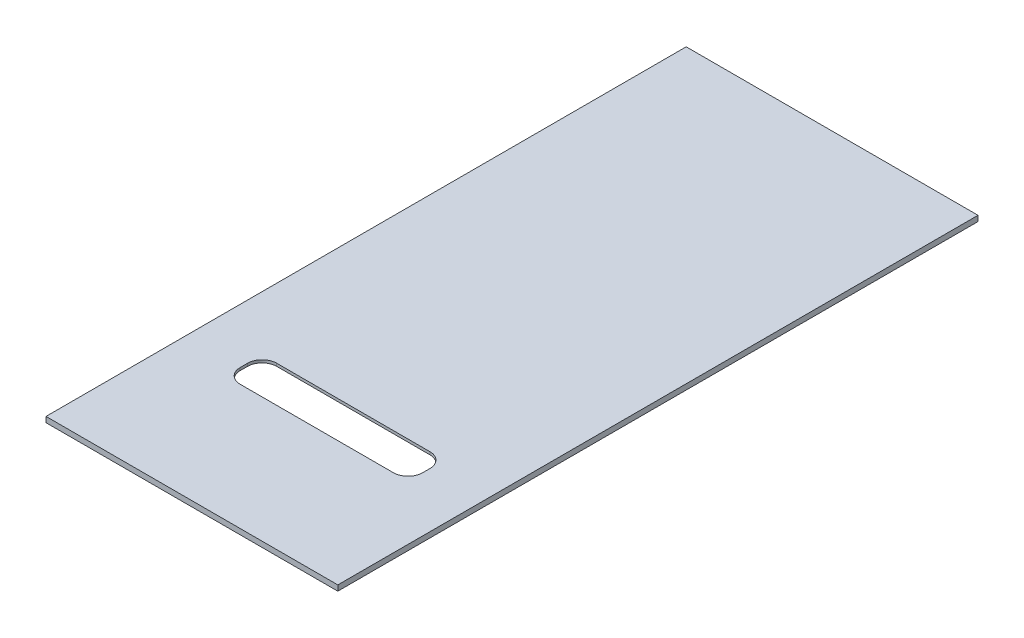
ISO-10303-21;
HEADER;
FILE_DESCRIPTION(('STEP AP214'),'2;1');
FILE_NAME('part.step','',(''),(''),'','','');
FILE_SCHEMA(('AUTOMOTIVE_DESIGN { 1 0 10303 214 1 1 1 1 }'));
ENDSEC;
DATA;
#1=APPLICATION_CONTEXT('core data for automotive mechanical design processes');
#2=APPLICATION_PROTOCOL_DEFINITION('international standard','automotive_design',2000,#1);
#3=PRODUCT_CONTEXT('',#1,'mechanical');
#4=PRODUCT('Part','Part','',(#3));
#5=PRODUCT_RELATED_PRODUCT_CATEGORY('part','',(#4));
#6=PRODUCT_DEFINITION_FORMATION('','',#4);
#7=PRODUCT_DEFINITION_CONTEXT('part definition',#1,'design');
#8=PRODUCT_DEFINITION('design','',#6,#7);
#9=PRODUCT_DEFINITION_SHAPE('','',#8);
#10=(LENGTH_UNIT() NAMED_UNIT(*) SI_UNIT(.MILLI.,.METRE.));
#11=(NAMED_UNIT(*) PLANE_ANGLE_UNIT() SI_UNIT($,.RADIAN.));
#12=(NAMED_UNIT(*) SI_UNIT($,.STERADIAN.) SOLID_ANGLE_UNIT());
#13=UNCERTAINTY_MEASURE_WITH_UNIT(LENGTH_MEASURE(1.E-05),#10,'distance_accuracy_value','');
#14=(GEOMETRIC_REPRESENTATION_CONTEXT(3) GLOBAL_UNCERTAINTY_ASSIGNED_CONTEXT((#13)) GLOBAL_UNIT_ASSIGNED_CONTEXT((#10,
#11,#12)) REPRESENTATION_CONTEXT('',''));
#15=CARTESIAN_POINT('',(0.,0.,0.));
#16=DIRECTION('',(0.,0.,1.));
#17=DIRECTION('',(1.,0.,0.));
#18=AXIS2_PLACEMENT_3D('',#15,#16,#17);
#19=CARTESIAN_POINT('',(80.,0.,223.5));
#20=DIRECTION('',(1.,0.,0.));
#21=DIRECTION('',(0.,0.,-1.));
#22=AXIS2_PLACEMENT_3D('',#19,#20,#21);
#23=PLANE('',#22);
#24=DIRECTION('',(0.,-1.,0.));
#25=VECTOR('',#24,1.);
#26=CARTESIAN_POINT('',(80.,-36.809382195833,175.5));
#27=LINE('',#26,#25);
#28=CARTESIAN_POINT('',(80.,57.,175.5));
#29=VERTEX_POINT('',#28);
#30=CARTESIAN_POINT('',(80.,54.,175.5));
#31=VERTEX_POINT('',#30);
#32=EDGE_CURVE('E281',#29,#31,#27,.T.);
#33=ORIENTED_EDGE('',*,*,#32,.T.);
#34=DIRECTION('',(0.,0.,1.));
#35=VECTOR('',#34,1.);
#36=CARTESIAN_POINT('',(80.,54.,81.));
#37=LINE('',#36,#35);
#38=CARTESIAN_POINT('',(80.,54.,-175.5));
#39=VERTEX_POINT('',#38);
#40=EDGE_CURVE('E183',#39,#31,#37,.T.);
#41=ORIENTED_EDGE('',*,*,#40,.F.);
#42=DIRECTION('',(0.,-1.,0.));
#43=VECTOR('',#42,1.);
#44=CARTESIAN_POINT('',(80.,0.,-175.5));
#45=LINE('',#44,#43);
#46=CARTESIAN_POINT('',(80.,57.,-175.5));
#47=VERTEX_POINT('',#46);
#48=EDGE_CURVE('E176',#47,#39,#45,.T.);
#49=ORIENTED_EDGE('',*,*,#48,.F.);
#50=DIRECTION('',(0.,0.,-1.));
#51=VECTOR('',#50,1.);
#52=CARTESIAN_POINT('',(80.,57.,140.));
#53=LINE('',#52,#51);
#54=EDGE_CURVE('E180',#29,#47,#53,.T.);
#55=ORIENTED_EDGE('',*,*,#54,.F.);
#56=EDGE_LOOP('',(#33,#41,#49,#55));
#57=FACE_BOUND('',#56,.T.);
#58=ADVANCED_FACE('F39',(#57),#23,.T.);
#59=CARTESIAN_POINT('',(-80.,0.,223.5));
#60=DIRECTION('',(1.,0.,0.));
#61=DIRECTION('',(0.,0.,-1.));
#62=AXIS2_PLACEMENT_3D('',#59,#60,#61);
#63=PLANE('',#62);
#64=DIRECTION('',(0.,0.,-1.));
#65=VECTOR('',#64,1.);
#66=CARTESIAN_POINT('',(-80.,57.,140.));
#67=LINE('',#66,#65);
#68=CARTESIAN_POINT('',(-80.,57.,175.5));
#69=VERTEX_POINT('',#68);
#70=CARTESIAN_POINT('',(-80.,57.,-175.5));
#71=VERTEX_POINT('',#70);
#72=EDGE_CURVE('E155',#69,#71,#67,.T.);
#73=ORIENTED_EDGE('',*,*,#72,.T.);
#74=DIRECTION('',(0.,-1.,0.));
#75=VECTOR('',#74,1.);
#76=CARTESIAN_POINT('',(-80.,0.,-175.5));
#77=LINE('',#76,#75);
#78=CARTESIAN_POINT('',(-80.,54.,-175.5));
#79=VERTEX_POINT('',#78);
#80=EDGE_CURVE('E158',#71,#79,#77,.T.);
#81=ORIENTED_EDGE('',*,*,#80,.T.);
#82=DIRECTION('',(0.,0.,1.));
#83=VECTOR('',#82,1.);
#84=CARTESIAN_POINT('',(-80.,54.,81.));
#85=LINE('',#84,#83);
#86=CARTESIAN_POINT('',(-80.,54.,175.5));
#87=VERTEX_POINT('',#86);
#88=EDGE_CURVE('E168',#79,#87,#85,.T.);
#89=ORIENTED_EDGE('',*,*,#88,.T.);
#90=DIRECTION('',(0.,-1.,0.));
#91=VECTOR('',#90,1.);
#92=CARTESIAN_POINT('',(-80.,-36.809382195833,175.5));
#93=LINE('',#92,#91);
#94=EDGE_CURVE('E161',#69,#87,#93,.T.);
#95=ORIENTED_EDGE('',*,*,#94,.F.);
#96=EDGE_LOOP('',(#73,#81,#89,#95));
#97=FACE_BOUND('',#96,.T.);
#98=ADVANCED_FACE('F157',(#97),#63,.F.);
#99=CARTESIAN_POINT('',(-60.5,-85.9125199474914,72.));
#100=DIRECTION('',(0.,0.,1.));
#101=DIRECTION('',(1.,0.,0.));
#102=AXIS2_PLACEMENT_3D('',#99,#100,#101);
#103=PLANE('',#102);
#104=DIRECTION('',(0.,1.,0.));
#105=VECTOR('',#104,1.);
#106=CARTESIAN_POINT('',(-60.5,-85.9125199474914,72.));
#107=LINE('',#106,#105);
#108=CARTESIAN_POINT('',(-60.5,54.,72.));
#109=VERTEX_POINT('',#108);
#110=CARTESIAN_POINT('',(-60.5,55.5,72.));
#111=VERTEX_POINT('',#110);
#112=EDGE_CURVE('E244',#109,#111,#107,.T.);
#113=ORIENTED_EDGE('',*,*,#112,.F.);
#114=DIRECTION('',(1.,0.,0.));
#115=VECTOR('',#114,1.);
#116=CARTESIAN_POINT('',(-60.5,54.,72.));
#117=LINE('',#116,#115);
#118=CARTESIAN_POINT('',(60.5,54.,72.));
#119=VERTEX_POINT('',#118);
#120=EDGE_CURVE('E56',#109,#119,#117,.T.);
#121=ORIENTED_EDGE('',*,*,#120,.T.);
#122=DIRECTION('',(0.,1.,0.));
#123=VECTOR('',#122,1.);
#124=CARTESIAN_POINT('',(60.5,-85.9125199474914,72.));
#125=LINE('',#124,#123);
#126=CARTESIAN_POINT('',(60.5,55.5,72.));
#127=VERTEX_POINT('',#126);
#128=EDGE_CURVE('E246',#119,#127,#125,.T.);
#129=ORIENTED_EDGE('',*,*,#128,.T.);
#130=DIRECTION('',(-1.,0.,0.));
#131=VECTOR('',#130,1.);
#132=CARTESIAN_POINT('',(60.5,55.5,72.));
#133=LINE('',#132,#131);
#134=EDGE_CURVE('E243',#127,#111,#133,.T.);
#135=ORIENTED_EDGE('',*,*,#134,.T.);
#136=EDGE_LOOP('',(#113,#121,#129,#135));
#137=FACE_BOUND('',#136,.T.);
#138=ADVANCED_FACE('F333',(#137),#103,.T.);
#139=CARTESIAN_POINT('',(60.5,47.,124.5));
#140=DIRECTION('',(0.,0.,-1.));
#141=DIRECTION('',(-1.,0.,0.));
#142=AXIS2_PLACEMENT_3D('',#139,#140,#141);
#143=PLANE('',#142);
#144=DIRECTION('',(0.,1.,0.));
#145=VECTOR('',#144,1.);
#146=CARTESIAN_POINT('',(60.5,47.,124.5));
#147=LINE('',#146,#145);
#148=CARTESIAN_POINT('',(60.5,54.,124.5));
#149=VERTEX_POINT('',#148);
#150=CARTESIAN_POINT('',(60.5,55.5,124.5));
#151=VERTEX_POINT('',#150);
#152=EDGE_CURVE('E247',#149,#151,#147,.T.);
#153=ORIENTED_EDGE('',*,*,#152,.F.);
#154=DIRECTION('',(-1.,0.,0.));
#155=VECTOR('',#154,1.);
#156=CARTESIAN_POINT('',(60.5,54.,124.5));
#157=LINE('',#156,#155);
#158=CARTESIAN_POINT('',(-60.5,54.,124.5));
#159=VERTEX_POINT('',#158);
#160=EDGE_CURVE('E328',#149,#159,#157,.T.);
#161=ORIENTED_EDGE('',*,*,#160,.T.);
#162=DIRECTION('',(0.,1.,0.));
#163=VECTOR('',#162,1.);
#164=CARTESIAN_POINT('',(-60.5,47.,124.5));
#165=LINE('',#164,#163);
#166=CARTESIAN_POINT('',(-60.5,55.5,124.5));
#167=VERTEX_POINT('',#166);
#168=EDGE_CURVE('E249',#159,#167,#165,.T.);
#169=ORIENTED_EDGE('',*,*,#168,.T.);
#170=DIRECTION('',(1.,0.,0.));
#171=VECTOR('',#170,1.);
#172=CARTESIAN_POINT('',(-60.5,55.5,124.5));
#173=LINE('',#172,#171);
#174=EDGE_CURVE('E310',#167,#151,#173,.T.);
#175=ORIENTED_EDGE('',*,*,#174,.T.);
#176=EDGE_LOOP('',(#153,#161,#169,#175));
#177=FACE_BOUND('',#176,.T.);
#178=ADVANCED_FACE('F325',(#177),#143,.T.);
#179=CARTESIAN_POINT('',(60.5,57.,140.));
#180=DIRECTION('',(1.,0.,0.));
#181=DIRECTION('',(0.,0.,-1.));
#182=AXIS2_PLACEMENT_3D('',#179,#180,#181);
#183=PLANE('',#182);
#184=DIRECTION('',(0.,0.,-1.));
#185=VECTOR('',#184,1.);
#186=CARTESIAN_POINT('',(60.5,54.,140.));
#187=LINE('',#186,#185);
#188=EDGE_CURVE('E282',#149,#119,#187,.T.);
#189=ORIENTED_EDGE('',*,*,#188,.F.);
#190=ORIENTED_EDGE('',*,*,#152,.T.);
#191=DIRECTION('',(0.,0.,-1.));
#192=VECTOR('',#191,1.);
#193=CARTESIAN_POINT('',(60.5,55.5,124.5));
#194=LINE('',#193,#192);
#195=EDGE_CURVE('E251',#151,#127,#194,.T.);
#196=ORIENTED_EDGE('',*,*,#195,.T.);
#197=ORIENTED_EDGE('',*,*,#128,.F.);
#198=EDGE_LOOP('',(#189,#190,#196,#197));
#199=FACE_BOUND('',#198,.T.);
#200=ADVANCED_FACE('F317',(#199),#183,.F.);
#201=CARTESIAN_POINT('',(115.999949632893,-36.809382195833,175.5));
#202=DIRECTION('',(0.,0.,-1.));
#203=DIRECTION('',(-1.,0.,0.));
#204=AXIS2_PLACEMENT_3D('',#201,#202,#203);
#205=PLANE('',#204);
#206=ORIENTED_EDGE('',*,*,#32,.F.);
#207=DIRECTION('',(-1.,0.,0.));
#208=VECTOR('',#207,1.);
#209=CARTESIAN_POINT('',(80.,57.,175.5));
#210=LINE('',#209,#208);
#211=EDGE_CURVE('E182',#29,#69,#210,.T.);
#212=ORIENTED_EDGE('',*,*,#211,.T.);
#213=ORIENTED_EDGE('',*,*,#94,.T.);
#214=DIRECTION('',(-1.,0.,0.));
#215=VECTOR('',#214,1.);
#216=CARTESIAN_POINT('',(80.,54.,175.5));
#217=LINE('',#216,#215);
#218=EDGE_CURVE('E189',#31,#87,#217,.T.);
#219=ORIENTED_EDGE('',*,*,#218,.F.);
#220=EDGE_LOOP('',(#206,#212,#213,#219));
#221=FACE_BOUND('',#220,.T.);
#222=ADVANCED_FACE('F280',(#221),#205,.F.);
#223=CARTESIAN_POINT('',(115.999949632893,-36.809382195833,-175.5));
#224=DIRECTION('',(0.,0.,1.));
#225=DIRECTION('',(-1.,0.,0.));
#226=AXIS2_PLACEMENT_3D('',#223,#224,#225);
#227=PLANE('',#226);
#228=ORIENTED_EDGE('',*,*,#48,.T.);
#229=DIRECTION('',(1.,0.,0.));
#230=VECTOR('',#229,1.);
#231=CARTESIAN_POINT('',(80.,54.,-175.5));
#232=LINE('',#231,#230);
#233=EDGE_CURVE('E167',#79,#39,#232,.T.);
#234=ORIENTED_EDGE('',*,*,#233,.F.);
#235=ORIENTED_EDGE('',*,*,#80,.F.);
#236=DIRECTION('',(-1.,0.,0.));
#237=VECTOR('',#236,1.);
#238=CARTESIAN_POINT('',(80.,57.,-175.5));
#239=LINE('',#238,#237);
#240=EDGE_CURVE('E174',#47,#71,#239,.T.);
#241=ORIENTED_EDGE('',*,*,#240,.F.);
#242=EDGE_LOOP('',(#228,#234,#235,#241));
#243=FACE_BOUND('',#242,.T.);
#244=ADVANCED_FACE('F173',(#243),#227,.F.);
#245=CARTESIAN_POINT('',(-60.5,57.,140.));
#246=DIRECTION('',(-1.,0.,0.));
#247=DIRECTION('',(0.,0.,-1.));
#248=AXIS2_PLACEMENT_3D('',#245,#246,#247);
#249=PLANE('',#248);
#250=DIRECTION('',(0.,0.,1.));
#251=VECTOR('',#250,1.);
#252=CARTESIAN_POINT('',(-60.5,54.,140.));
#253=LINE('',#252,#251);
#254=EDGE_CURVE('E331',#109,#159,#253,.T.);
#255=ORIENTED_EDGE('',*,*,#254,.F.);
#256=ORIENTED_EDGE('',*,*,#112,.T.);
#257=DIRECTION('',(0.,0.,1.));
#258=VECTOR('',#257,1.);
#259=CARTESIAN_POINT('',(-60.5,55.5,72.));
#260=LINE('',#259,#258);
#261=EDGE_CURVE('E306',#111,#167,#260,.T.);
#262=ORIENTED_EDGE('',*,*,#261,.T.);
#263=ORIENTED_EDGE('',*,*,#168,.F.);
#264=EDGE_LOOP('',(#255,#256,#262,#263));
#265=FACE_BOUND('',#264,.T.);
#266=ADVANCED_FACE('F330',(#265),#249,.F.);
#267=CARTESIAN_POINT('',(0.,55.5,0.));
#268=DIRECTION('',(0.,1.,0.));
#269=DIRECTION('',(0.,0.,1.));
#270=AXIS2_PLACEMENT_3D('',#267,#268,#269);
#271=PLANE('',#270);
#272=ORIENTED_EDGE('',*,*,#134,.F.);
#273=ORIENTED_EDGE('',*,*,#195,.F.);
#274=ORIENTED_EDGE('',*,*,#174,.F.);
#275=ORIENTED_EDGE('',*,*,#261,.F.);
#276=EDGE_LOOP('',(#272,#273,#274,#275));
#277=FACE_BOUND('',#276,.T.);
#278=DIRECTION('',(0.,0.,1.));
#279=VECTOR('',#278,1.);
#280=CARTESIAN_POINT('',(50.,55.5,87.));
#281=LINE('',#280,#279);
#282=CARTESIAN_POINT('',(50.,55.5,95.));
#283=VERTEX_POINT('',#282);
#284=CARTESIAN_POINT('',(50.,55.5,99.));
#285=VERTEX_POINT('',#284);
#286=EDGE_CURVE('E284',#283,#285,#281,.T.);
#287=ORIENTED_EDGE('',*,*,#286,.F.);
#288=CARTESIAN_POINT('',(42.,55.5,95.));
#289=DIRECTION('',(0.,1.,0.));
#290=DIRECTION('',(0.,0.,1.));
#291=AXIS2_PLACEMENT_3D('',#288,#289,#290);
#292=CIRCLE('',#291,8.);
#293=CARTESIAN_POINT('',(42.,55.5,87.));
#294=VERTEX_POINT('',#293);
#295=EDGE_CURVE('E228',#283,#294,#292,.T.);
#296=ORIENTED_EDGE('',*,*,#295,.T.);
#297=DIRECTION('',(1.,0.,0.));
#298=VECTOR('',#297,1.);
#299=CARTESIAN_POINT('',(-50.,55.5,87.));
#300=LINE('',#299,#298);
#301=CARTESIAN_POINT('',(-42.,55.5,87.));
#302=VERTEX_POINT('',#301);
#303=EDGE_CURVE('E302',#302,#294,#300,.T.);
#304=ORIENTED_EDGE('',*,*,#303,.F.);
#305=CARTESIAN_POINT('',(-42.,55.5,95.));
#306=DIRECTION('',(0.,1.,0.));
#307=DIRECTION('',(0.,0.,1.));
#308=AXIS2_PLACEMENT_3D('',#305,#306,#307);
#309=CIRCLE('',#308,8.);
#310=CARTESIAN_POINT('',(-50.,55.5,95.));
#311=VERTEX_POINT('',#310);
#312=EDGE_CURVE('E48',#302,#311,#309,.T.);
#313=ORIENTED_EDGE('',*,*,#312,.T.);
#314=DIRECTION('',(0.,0.,-1.));
#315=VECTOR('',#314,1.);
#316=CARTESIAN_POINT('',(-50.,55.5,87.));
#317=LINE('',#316,#315);
#318=CARTESIAN_POINT('',(-50.,55.5,99.));
#319=VERTEX_POINT('',#318);
#320=EDGE_CURVE('E300',#319,#311,#317,.T.);
#321=ORIENTED_EDGE('',*,*,#320,.F.);
#322=CARTESIAN_POINT('',(-42.,55.5,99.));
#323=DIRECTION('',(0.,1.,0.));
#324=DIRECTION('',(0.,0.,1.));
#325=AXIS2_PLACEMENT_3D('',#322,#323,#324);
#326=CIRCLE('',#325,8.);
#327=CARTESIAN_POINT('',(-42.,55.5,107.));
#328=VERTEX_POINT('',#327);
#329=EDGE_CURVE('E232',#319,#328,#326,.T.);
#330=ORIENTED_EDGE('',*,*,#329,.T.);
#331=DIRECTION('',(-1.,0.,0.));
#332=VECTOR('',#331,1.);
#333=CARTESIAN_POINT('',(-50.,55.5,107.));
#334=LINE('',#333,#332);
#335=CARTESIAN_POINT('',(42.,55.5,107.));
#336=VERTEX_POINT('',#335);
#337=EDGE_CURVE('E297',#336,#328,#334,.T.);
#338=ORIENTED_EDGE('',*,*,#337,.F.);
#339=CARTESIAN_POINT('',(42.,55.5,99.));
#340=DIRECTION('',(0.,1.,0.));
#341=DIRECTION('',(0.,0.,1.));
#342=AXIS2_PLACEMENT_3D('',#339,#340,#341);
#343=CIRCLE('',#342,8.);
#344=EDGE_CURVE('E224',#336,#285,#343,.T.);
#345=ORIENTED_EDGE('',*,*,#344,.T.);
#346=EDGE_LOOP('',(#287,#296,#304,#313,#321,#330,#338,#345));
#347=FACE_BOUND('',#346,.T.);
#348=ADVANCED_FACE('F321',(#277,#347),#271,.F.);
#349=CARTESIAN_POINT('',(60.5,57.,140.));
#350=DIRECTION('',(0.,-1.,0.));
#351=DIRECTION('',(0.,0.,-1.));
#352=AXIS2_PLACEMENT_3D('',#349,#350,#351);
#353=PLANE('',#352);
#354=DIRECTION('',(0.,0.,-1.));
#355=VECTOR('',#354,1.);
#356=CARTESIAN_POINT('',(-50.,57.,140.));
#357=LINE('',#356,#355);
#358=CARTESIAN_POINT('',(-50.,57.,99.));
#359=VERTEX_POINT('',#358);
#360=CARTESIAN_POINT('',(-50.,57.,95.));
#361=VERTEX_POINT('',#360);
#362=EDGE_CURVE('E197',#359,#361,#357,.T.);
#363=ORIENTED_EDGE('',*,*,#362,.T.);
#364=CARTESIAN_POINT('',(-42.,57.,95.));
#365=DIRECTION('',(0.,-1.,0.));
#366=DIRECTION('',(0.,0.,-1.));
#367=AXIS2_PLACEMENT_3D('',#364,#365,#366);
#368=CIRCLE('',#367,8.);
#369=CARTESIAN_POINT('',(-42.,57.,87.));
#370=VERTEX_POINT('',#369);
#371=EDGE_CURVE('E11',#361,#370,#368,.T.);
#372=ORIENTED_EDGE('',*,*,#371,.T.);
#373=DIRECTION('',(1.,0.,0.));
#374=VECTOR('',#373,1.);
#375=CARTESIAN_POINT('',(60.5,57.,87.));
#376=LINE('',#375,#374);
#377=CARTESIAN_POINT('',(42.,57.,87.));
#378=VERTEX_POINT('',#377);
#379=EDGE_CURVE('E199',#370,#378,#376,.T.);
#380=ORIENTED_EDGE('',*,*,#379,.T.);
#381=CARTESIAN_POINT('',(42.,57.,95.));
#382=DIRECTION('',(0.,-1.,0.));
#383=DIRECTION('',(0.,0.,-1.));
#384=AXIS2_PLACEMENT_3D('',#381,#382,#383);
#385=CIRCLE('',#384,8.);
#386=CARTESIAN_POINT('',(50.,57.,95.));
#387=VERTEX_POINT('',#386);
#388=EDGE_CURVE('E230',#378,#387,#385,.T.);
#389=ORIENTED_EDGE('',*,*,#388,.T.);
#390=DIRECTION('',(0.,0.,1.));
#391=VECTOR('',#390,1.);
#392=CARTESIAN_POINT('',(50.,57.,140.));
#393=LINE('',#392,#391);
#394=CARTESIAN_POINT('',(50.,57.,99.));
#395=VERTEX_POINT('',#394);
#396=EDGE_CURVE('E202',#387,#395,#393,.T.);
#397=ORIENTED_EDGE('',*,*,#396,.T.);
#398=CARTESIAN_POINT('',(42.,57.,99.));
#399=DIRECTION('',(0.,-1.,0.));
#400=DIRECTION('',(0.,0.,-1.));
#401=AXIS2_PLACEMENT_3D('',#398,#399,#400);
#402=CIRCLE('',#401,8.);
#403=CARTESIAN_POINT('',(42.,57.,107.));
#404=VERTEX_POINT('',#403);
#405=EDGE_CURVE('E226',#395,#404,#402,.T.);
#406=ORIENTED_EDGE('',*,*,#405,.T.);
#407=DIRECTION('',(-1.,0.,0.));
#408=VECTOR('',#407,1.);
#409=CARTESIAN_POINT('',(60.5,57.,107.));
#410=LINE('',#409,#408);
#411=CARTESIAN_POINT('',(-42.,57.,107.));
#412=VERTEX_POINT('',#411);
#413=EDGE_CURVE('E194',#404,#412,#410,.T.);
#414=ORIENTED_EDGE('',*,*,#413,.T.);
#415=CARTESIAN_POINT('',(-42.,57.,99.));
#416=DIRECTION('',(0.,-1.,0.));
#417=DIRECTION('',(0.,0.,-1.));
#418=AXIS2_PLACEMENT_3D('',#415,#416,#417);
#419=CIRCLE('',#418,8.);
#420=EDGE_CURVE('E234',#412,#359,#419,.T.);
#421=ORIENTED_EDGE('',*,*,#420,.T.);
#422=EDGE_LOOP('',(#363,#372,#380,#389,#397,#406,#414,#421));
#423=FACE_BOUND('',#422,.T.);
#424=ORIENTED_EDGE('',*,*,#240,.T.);
#425=ORIENTED_EDGE('',*,*,#72,.F.);
#426=ORIENTED_EDGE('',*,*,#211,.F.);
#427=ORIENTED_EDGE('',*,*,#54,.T.);
#428=EDGE_LOOP('',(#424,#425,#426,#427));
#429=FACE_BOUND('',#428,.T.);
#430=ADVANCED_FACE('F179',(#423,#429),#353,.F.);
#431=CARTESIAN_POINT('',(80.,54.,-109.));
#432=DIRECTION('',(0.,1.,0.));
#433=DIRECTION('',(0.,0.,1.));
#434=AXIS2_PLACEMENT_3D('',#431,#432,#433);
#435=PLANE('',#434);
#436=ORIENTED_EDGE('',*,*,#233,.T.);
#437=ORIENTED_EDGE('',*,*,#40,.T.);
#438=ORIENTED_EDGE('',*,*,#218,.T.);
#439=ORIENTED_EDGE('',*,*,#88,.F.);
#440=EDGE_LOOP('',(#436,#437,#438,#439));
#441=FACE_BOUND('',#440,.T.);
#442=ORIENTED_EDGE('',*,*,#188,.T.);
#443=ORIENTED_EDGE('',*,*,#120,.F.);
#444=ORIENTED_EDGE('',*,*,#254,.T.);
#445=ORIENTED_EDGE('',*,*,#160,.F.);
#446=EDGE_LOOP('',(#442,#443,#444,#445));
#447=FACE_BOUND('',#446,.T.);
#448=ADVANCED_FACE('F276',(#441,#447),#435,.F.);
#449=CARTESIAN_POINT('',(50.,65.5,87.));
#450=DIRECTION('',(1.,0.,0.));
#451=DIRECTION('',(0.,0.,-1.));
#452=AXIS2_PLACEMENT_3D('',#449,#450,#451);
#453=PLANE('',#452);
#454=ORIENTED_EDGE('',*,*,#286,.T.);
#455=DIRECTION('',(0.,-1.,0.));
#456=VECTOR('',#455,1.);
#457=CARTESIAN_POINT('',(50.,57.,99.));
#458=LINE('',#457,#456);
#459=EDGE_CURVE('E213',#285,#395,#458,.F.);
#460=ORIENTED_EDGE('',*,*,#459,.T.);
#461=ORIENTED_EDGE('',*,*,#396,.F.);
#462=DIRECTION('',(0.,-1.,0.));
#463=VECTOR('',#462,1.);
#464=CARTESIAN_POINT('',(50.,55.5,95.));
#465=LINE('',#464,#463);
#466=EDGE_CURVE('E210',#387,#283,#465,.T.);
#467=ORIENTED_EDGE('',*,*,#466,.T.);
#468=EDGE_LOOP('',(#454,#460,#461,#467));
#469=FACE_BOUND('',#468,.T.);
#470=ADVANCED_FACE('F340',(#469),#453,.F.);
#471=CARTESIAN_POINT('',(-50.,65.5,87.));
#472=DIRECTION('',(0.,0.,-1.));
#473=DIRECTION('',(-1.,0.,0.));
#474=AXIS2_PLACEMENT_3D('',#471,#472,#473);
#475=PLANE('',#474);
#476=ORIENTED_EDGE('',*,*,#303,.T.);
#477=DIRECTION('',(0.,-1.,0.));
#478=VECTOR('',#477,1.);
#479=CARTESIAN_POINT('',(42.,57.,87.));
#480=LINE('',#479,#478);
#481=EDGE_CURVE('E218',#294,#378,#480,.F.);
#482=ORIENTED_EDGE('',*,*,#481,.T.);
#483=ORIENTED_EDGE('',*,*,#379,.F.);
#484=DIRECTION('',(0.,-1.,0.));
#485=VECTOR('',#484,1.);
#486=CARTESIAN_POINT('',(-42.,55.5,87.));
#487=LINE('',#486,#485);
#488=EDGE_CURVE('E215',#370,#302,#487,.T.);
#489=ORIENTED_EDGE('',*,*,#488,.T.);
#490=EDGE_LOOP('',(#476,#482,#483,#489));
#491=FACE_BOUND('',#490,.T.);
#492=ADVANCED_FACE('F346',(#491),#475,.F.);
#493=CARTESIAN_POINT('',(-50.,65.5,87.));
#494=DIRECTION('',(-1.,0.,0.));
#495=DIRECTION('',(0.,0.,1.));
#496=AXIS2_PLACEMENT_3D('',#493,#494,#495);
#497=PLANE('',#496);
#498=ORIENTED_EDGE('',*,*,#362,.F.);
#499=DIRECTION('',(0.,-1.,0.));
#500=VECTOR('',#499,1.);
#501=CARTESIAN_POINT('',(-50.,55.5,99.));
#502=LINE('',#501,#500);
#503=EDGE_CURVE('E221',#359,#319,#502,.T.);
#504=ORIENTED_EDGE('',*,*,#503,.T.);
#505=ORIENTED_EDGE('',*,*,#320,.T.);
#506=DIRECTION('',(0.,-1.,0.));
#507=VECTOR('',#506,1.);
#508=CARTESIAN_POINT('',(-50.,57.,95.));
#509=LINE('',#508,#507);
#510=EDGE_CURVE('E64',#311,#361,#509,.F.);
#511=ORIENTED_EDGE('',*,*,#510,.T.);
#512=EDGE_LOOP('',(#498,#504,#505,#511));
#513=FACE_BOUND('',#512,.T.);
#514=ADVANCED_FACE('F364',(#513),#497,.F.);
#515=CARTESIAN_POINT('',(-50.,65.5,107.));
#516=DIRECTION('',(0.,0.,1.));
#517=DIRECTION('',(1.,0.,0.));
#518=AXIS2_PLACEMENT_3D('',#515,#516,#517);
#519=PLANE('',#518);
#520=ORIENTED_EDGE('',*,*,#413,.F.);
#521=DIRECTION('',(0.,-1.,0.));
#522=VECTOR('',#521,1.);
#523=CARTESIAN_POINT('',(42.,55.5,107.));
#524=LINE('',#523,#522);
#525=EDGE_CURVE('E207',#404,#336,#524,.T.);
#526=ORIENTED_EDGE('',*,*,#525,.T.);
#527=ORIENTED_EDGE('',*,*,#337,.T.);
#528=DIRECTION('',(0.,-1.,0.));
#529=VECTOR('',#528,1.);
#530=CARTESIAN_POINT('',(-42.,57.,107.));
#531=LINE('',#530,#529);
#532=EDGE_CURVE('E205',#328,#412,#531,.F.);
#533=ORIENTED_EDGE('',*,*,#532,.T.);
#534=EDGE_LOOP('',(#520,#526,#527,#533));
#535=FACE_BOUND('',#534,.T.);
#536=ADVANCED_FACE('F368',(#535),#519,.F.);
#537=CARTESIAN_POINT('',(42.,65.5,99.));
#538=DIRECTION('',(0.,1.,0.));
#539=DIRECTION('',(0.,0.,1.));
#540=AXIS2_PLACEMENT_3D('',#537,#538,#539);
#541=CYLINDRICAL_SURFACE('',#540,8.);
#542=ORIENTED_EDGE('',*,*,#405,.F.);
#543=ORIENTED_EDGE('',*,*,#459,.F.);
#544=ORIENTED_EDGE('',*,*,#344,.F.);
#545=ORIENTED_EDGE('',*,*,#525,.F.);
#546=EDGE_LOOP('',(#542,#543,#544,#545));
#547=FACE_BOUND('',#546,.T.);
#548=ADVANCED_FACE('F370',(#547),#541,.F.);
#549=CARTESIAN_POINT('',(42.,65.5,95.));
#550=DIRECTION('',(0.,1.,0.));
#551=DIRECTION('',(0.,0.,1.));
#552=AXIS2_PLACEMENT_3D('',#549,#550,#551);
#553=CYLINDRICAL_SURFACE('',#552,8.);
#554=ORIENTED_EDGE('',*,*,#388,.F.);
#555=ORIENTED_EDGE('',*,*,#481,.F.);
#556=ORIENTED_EDGE('',*,*,#295,.F.);
#557=ORIENTED_EDGE('',*,*,#466,.F.);
#558=EDGE_LOOP('',(#554,#555,#556,#557));
#559=FACE_BOUND('',#558,.T.);
#560=ADVANCED_FACE('F391',(#559),#553,.F.);
#561=CARTESIAN_POINT('',(-42.,65.5,99.));
#562=DIRECTION('',(0.,1.,0.));
#563=DIRECTION('',(0.,0.,1.));
#564=AXIS2_PLACEMENT_3D('',#561,#562,#563);
#565=CYLINDRICAL_SURFACE('',#564,8.);
#566=ORIENTED_EDGE('',*,*,#420,.F.);
#567=ORIENTED_EDGE('',*,*,#532,.F.);
#568=ORIENTED_EDGE('',*,*,#329,.F.);
#569=ORIENTED_EDGE('',*,*,#503,.F.);
#570=EDGE_LOOP('',(#566,#567,#568,#569));
#571=FACE_BOUND('',#570,.T.);
#572=ADVANCED_FACE('F394',(#571),#565,.F.);
#573=CARTESIAN_POINT('',(-42.,65.5,95.));
#574=DIRECTION('',(0.,1.,0.));
#575=DIRECTION('',(0.,0.,1.));
#576=AXIS2_PLACEMENT_3D('',#573,#574,#575);
#577=CYLINDRICAL_SURFACE('',#576,8.);
#578=ORIENTED_EDGE('',*,*,#371,.F.);
#579=ORIENTED_EDGE('',*,*,#510,.F.);
#580=ORIENTED_EDGE('',*,*,#312,.F.);
#581=ORIENTED_EDGE('',*,*,#488,.F.);
#582=EDGE_LOOP('',(#578,#579,#580,#581));
#583=FACE_BOUND('',#582,.T.);
#584=ADVANCED_FACE('F41',(#583),#577,.F.);
#585=CLOSED_SHELL('',(#58,#98,#138,#178,#200,#222,#244,#266,#348,#430,#448,#470,#492,#514,#536,
#548,#560,#572,#584));
#586=MANIFOLD_SOLID_BREP('B2',#585);
#587=ADVANCED_BREP_SHAPE_REPRESENTATION('',(#18,#586),#14);
#588=SHAPE_DEFINITION_REPRESENTATION(#9,#587);
ENDSEC;
END-ISO-10303-21;
